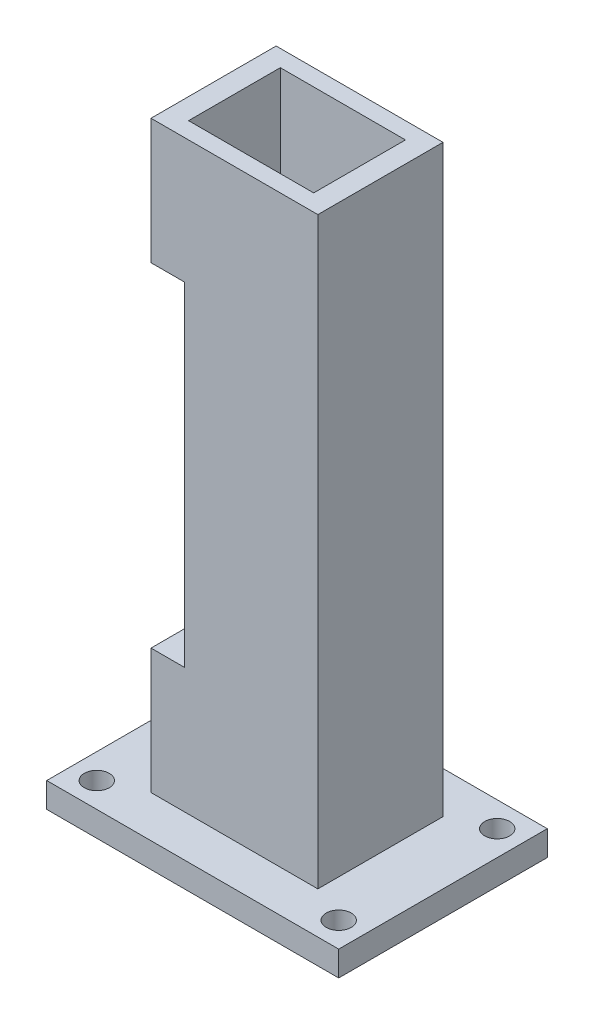
ISO-10303-21;
HEADER;
FILE_DESCRIPTION(('STEP AP214'),'2;1');
FILE_NAME('part.step','',(''),(''),'','','');
FILE_SCHEMA(('AUTOMOTIVE_DESIGN { 1 0 10303 214 1 1 1 1 }'));
ENDSEC;
DATA;
#1=APPLICATION_CONTEXT('core data for automotive mechanical design processes');
#2=APPLICATION_PROTOCOL_DEFINITION('international standard','automotive_design',2000,#1);
#3=PRODUCT_CONTEXT('',#1,'mechanical');
#4=PRODUCT('Part','Part','',(#3));
#5=PRODUCT_RELATED_PRODUCT_CATEGORY('part','',(#4));
#6=PRODUCT_DEFINITION_FORMATION('','',#4);
#7=PRODUCT_DEFINITION_CONTEXT('part definition',#1,'design');
#8=PRODUCT_DEFINITION('design','',#6,#7);
#9=PRODUCT_DEFINITION_SHAPE('','',#8);
#10=(LENGTH_UNIT() NAMED_UNIT(*) SI_UNIT(.MILLI.,.METRE.));
#11=(NAMED_UNIT(*) PLANE_ANGLE_UNIT() SI_UNIT($,.RADIAN.));
#12=(NAMED_UNIT(*) SI_UNIT($,.STERADIAN.) SOLID_ANGLE_UNIT());
#13=UNCERTAINTY_MEASURE_WITH_UNIT(LENGTH_MEASURE(1.E-05),#10,'distance_accuracy_value','');
#14=(GEOMETRIC_REPRESENTATION_CONTEXT(3) GLOBAL_UNCERTAINTY_ASSIGNED_CONTEXT((#13)) GLOBAL_UNIT_ASSIGNED_CONTEXT((#10,
#11,#12)) REPRESENTATION_CONTEXT('',''));
#15=CARTESIAN_POINT('',(0.,0.,0.));
#16=DIRECTION('',(0.,0.,1.));
#17=DIRECTION('',(1.,0.,0.));
#18=AXIS2_PLACEMENT_3D('',#15,#16,#17);
#19=CARTESIAN_POINT('',(-10.,73.,7.5));
#20=DIRECTION('',(1.,0.,0.));
#21=DIRECTION('',(0.,0.,-1.));
#22=AXIS2_PLACEMENT_3D('',#19,#20,#21);
#23=PLANE('',#22);
#24=DIRECTION('',(0.,-1.,0.));
#25=VECTOR('',#24,1.);
#26=CARTESIAN_POINT('',(-10.,73.,-7.5));
#27=LINE('',#26,#25);
#28=CARTESIAN_POINT('',(-10.,73.,-7.5));
#29=VERTEX_POINT('',#28);
#30=CARTESIAN_POINT('',(-10.,58.,-7.5));
#31=VERTEX_POINT('',#30);
#32=EDGE_CURVE('E200',#29,#31,#27,.T.);
#33=ORIENTED_EDGE('',*,*,#32,.T.);
#34=DIRECTION('',(0.,0.,1.));
#35=VECTOR('',#34,1.);
#36=CARTESIAN_POINT('',(-10.,58.,-12.501));
#37=LINE('',#36,#35);
#38=CARTESIAN_POINT('',(-10.,58.,7.5));
#39=VERTEX_POINT('',#38);
#40=EDGE_CURVE('E578',#31,#39,#37,.T.);
#41=ORIENTED_EDGE('',*,*,#40,.T.);
#42=DIRECTION('',(0.,-1.,0.));
#43=VECTOR('',#42,1.);
#44=CARTESIAN_POINT('',(-10.,73.,7.5));
#45=LINE('',#44,#43);
#46=CARTESIAN_POINT('',(-10.,73.,7.5));
#47=VERTEX_POINT('',#46);
#48=EDGE_CURVE('E201',#47,#39,#45,.T.);
#49=ORIENTED_EDGE('',*,*,#48,.F.);
#50=DIRECTION('',(0.,0.,1.));
#51=VECTOR('',#50,1.);
#52=CARTESIAN_POINT('',(-10.,73.,7.5));
#53=LINE('',#52,#51);
#54=EDGE_CURVE('E631',#29,#47,#53,.T.);
#55=ORIENTED_EDGE('',*,*,#54,.F.);
#56=EDGE_LOOP('',(#33,#41,#49,#55));
#57=FACE_BOUND('',#56,.T.);
#58=ADVANCED_FACE('F40',(#57),#23,.F.);
#59=CARTESIAN_POINT('',(-7.5,-0.001000000000001,5.5));
#60=DIRECTION('',(-1.,0.,0.));
#61=DIRECTION('',(0.,0.,1.));
#62=AXIS2_PLACEMENT_3D('',#59,#60,#61);
#63=PLANE('',#62);
#64=DIRECTION('',(0.,1.,0.));
#65=VECTOR('',#64,1.);
#66=CARTESIAN_POINT('',(-7.5,-0.001000000000001,5.5));
#67=LINE('',#66,#65);
#68=CARTESIAN_POINT('',(-7.5,58.,5.5));
#69=VERTEX_POINT('',#68);
#70=CARTESIAN_POINT('',(-7.5,73.,5.5));
#71=VERTEX_POINT('',#70);
#72=EDGE_CURVE('E615',#69,#71,#67,.T.);
#73=ORIENTED_EDGE('',*,*,#72,.F.);
#74=DIRECTION('',(0.,0.,1.));
#75=VECTOR('',#74,1.);
#76=CARTESIAN_POINT('',(-7.5,58.,-12.501));
#77=LINE('',#76,#75);
#78=CARTESIAN_POINT('',(-7.5,58.,-5.5));
#79=VERTEX_POINT('',#78);
#80=EDGE_CURVE('E559',#79,#69,#77,.T.);
#81=ORIENTED_EDGE('',*,*,#80,.F.);
#82=DIRECTION('',(0.,1.,0.));
#83=VECTOR('',#82,1.);
#84=CARTESIAN_POINT('',(-7.5,-0.001000000000001,-5.5));
#85=LINE('',#84,#83);
#86=CARTESIAN_POINT('',(-7.5,73.,-5.5));
#87=VERTEX_POINT('',#86);
#88=EDGE_CURVE('E619',#79,#87,#85,.T.);
#89=ORIENTED_EDGE('',*,*,#88,.T.);
#90=DIRECTION('',(0.,0.,1.));
#91=VECTOR('',#90,1.);
#92=CARTESIAN_POINT('',(-7.5,73.,5.5));
#93=LINE('',#92,#91);
#94=EDGE_CURVE('E602',#87,#71,#93,.T.);
#95=ORIENTED_EDGE('',*,*,#94,.T.);
#96=EDGE_LOOP('',(#73,#81,#89,#95));
#97=FACE_BOUND('',#96,.T.);
#98=ADVANCED_FACE('F263',(#97),#63,.F.);
#99=CARTESIAN_POINT('',(0.,3.,0.));
#100=DIRECTION('',(0.,-1.,0.));
#101=DIRECTION('',(0.,0.,-1.));
#102=AXIS2_PLACEMENT_3D('',#99,#100,#101);
#103=PLANE('',#102);
#104=CARTESIAN_POINT('',(14.5,3.,-9.50000000000001));
#105=DIRECTION('',(0.,1.,0.));
#106=DIRECTION('',(0.,0.,1.));
#107=AXIS2_PLACEMENT_3D('',#104,#105,#106);
#108=CIRCLE('',#107,1.5);
#109=CARTESIAN_POINT('',(14.5,3.,-8.00000000000001));
#110=VERTEX_POINT('',#109);
#111=EDGE_CURVE('E536',#110,#110,#108,.T.);
#112=ORIENTED_EDGE('',*,*,#111,.F.);
#113=EDGE_LOOP('',(#112));
#114=FACE_BOUND('',#113,.T.);
#115=CARTESIAN_POINT('',(-14.5,3.,9.5));
#116=DIRECTION('',(0.,1.,0.));
#117=DIRECTION('',(0.,0.,1.));
#118=AXIS2_PLACEMENT_3D('',#115,#116,#117);
#119=CIRCLE('',#118,1.5);
#120=CARTESIAN_POINT('',(-14.5,3.,11.));
#121=VERTEX_POINT('',#120);
#122=EDGE_CURVE('E542',#121,#121,#119,.T.);
#123=ORIENTED_EDGE('',*,*,#122,.F.);
#124=EDGE_LOOP('',(#123));
#125=FACE_BOUND('',#124,.T.);
#126=CARTESIAN_POINT('',(14.5,3.,9.5));
#127=DIRECTION('',(0.,1.,0.));
#128=DIRECTION('',(0.,0.,1.));
#129=AXIS2_PLACEMENT_3D('',#126,#127,#128);
#130=CIRCLE('',#129,1.5);
#131=CARTESIAN_POINT('',(14.5,3.,11.));
#132=VERTEX_POINT('',#131);
#133=EDGE_CURVE('E680',#132,#132,#130,.T.);
#134=ORIENTED_EDGE('',*,*,#133,.F.);
#135=EDGE_LOOP('',(#134));
#136=FACE_BOUND('',#135,.T.);
#137=CARTESIAN_POINT('',(-14.5,3.,-9.5));
#138=DIRECTION('',(0.,1.,0.));
#139=DIRECTION('',(0.,0.,1.));
#140=AXIS2_PLACEMENT_3D('',#137,#138,#139);
#141=CIRCLE('',#140,1.5);
#142=CARTESIAN_POINT('',(-14.5,3.,-8.00000000000001));
#143=VERTEX_POINT('',#142);
#144=EDGE_CURVE('E549',#143,#143,#141,.T.);
#145=ORIENTED_EDGE('',*,*,#144,.F.);
#146=EDGE_LOOP('',(#145));
#147=FACE_BOUND('',#146,.T.);
#148=DIRECTION('',(0.,0.,-1.));
#149=VECTOR('',#148,1.);
#150=CARTESIAN_POINT('',(17.5,3.,12.5));
#151=LINE('',#150,#149);
#152=CARTESIAN_POINT('',(17.5,3.,12.5));
#153=VERTEX_POINT('',#152);
#154=CARTESIAN_POINT('',(17.5,3.,-12.5));
#155=VERTEX_POINT('',#154);
#156=EDGE_CURVE('E211',#153,#155,#151,.T.);
#157=ORIENTED_EDGE('',*,*,#156,.T.);
#158=DIRECTION('',(-1.,0.,0.));
#159=VECTOR('',#158,1.);
#160=CARTESIAN_POINT('',(-17.5,3.,-12.5));
#161=LINE('',#160,#159);
#162=CARTESIAN_POINT('',(-17.5,3.,-12.5));
#163=VERTEX_POINT('',#162);
#164=EDGE_CURVE('E214',#155,#163,#161,.T.);
#165=ORIENTED_EDGE('',*,*,#164,.T.);
#166=DIRECTION('',(0.,0.,1.));
#167=VECTOR('',#166,1.);
#168=CARTESIAN_POINT('',(-17.5,3.,12.5));
#169=LINE('',#168,#167);
#170=CARTESIAN_POINT('',(-17.5,3.,12.5));
#171=VERTEX_POINT('',#170);
#172=EDGE_CURVE('E217',#163,#171,#169,.T.);
#173=ORIENTED_EDGE('',*,*,#172,.T.);
#174=DIRECTION('',(1.,0.,0.));
#175=VECTOR('',#174,1.);
#176=CARTESIAN_POINT('',(-17.5,3.,12.5));
#177=LINE('',#176,#175);
#178=EDGE_CURVE('E219',#171,#153,#177,.T.);
#179=ORIENTED_EDGE('',*,*,#178,.T.);
#180=EDGE_LOOP('',(#157,#165,#173,#179));
#181=FACE_BOUND('',#180,.T.);
#182=DIRECTION('',(0.,0.,-1.));
#183=VECTOR('',#182,1.);
#184=CARTESIAN_POINT('',(10.,3.,7.5));
#185=LINE('',#184,#183);
#186=CARTESIAN_POINT('',(10.,3.,7.5));
#187=VERTEX_POINT('',#186);
#188=CARTESIAN_POINT('',(10.,3.,-7.5));
#189=VERTEX_POINT('',#188);
#190=EDGE_CURVE('E624',#187,#189,#185,.T.);
#191=ORIENTED_EDGE('',*,*,#190,.F.);
#192=DIRECTION('',(1.,0.,0.));
#193=VECTOR('',#192,1.);
#194=CARTESIAN_POINT('',(-10.,3.,7.5));
#195=LINE('',#194,#193);
#196=CARTESIAN_POINT('',(-10.,3.,7.5));
#197=VERTEX_POINT('',#196);
#198=EDGE_CURVE('E629',#197,#187,#195,.T.);
#199=ORIENTED_EDGE('',*,*,#198,.F.);
#200=DIRECTION('',(0.,0.,1.));
#201=VECTOR('',#200,1.);
#202=CARTESIAN_POINT('',(-10.,3.,7.5));
#203=LINE('',#202,#201);
#204=CARTESIAN_POINT('',(-10.,3.,-7.5));
#205=VERTEX_POINT('',#204);
#206=EDGE_CURVE('E639',#205,#197,#203,.T.);
#207=ORIENTED_EDGE('',*,*,#206,.F.);
#208=DIRECTION('',(-1.,0.,0.));
#209=VECTOR('',#208,1.);
#210=CARTESIAN_POINT('',(-10.,3.,-7.5));
#211=LINE('',#210,#209);
#212=EDGE_CURVE('E199',#189,#205,#211,.T.);
#213=ORIENTED_EDGE('',*,*,#212,.F.);
#214=EDGE_LOOP('',(#191,#199,#207,#213));
#215=FACE_BOUND('',#214,.T.);
#216=ADVANCED_FACE('F253',(#114,#125,#136,#147,#181,#215),#103,.F.);
#217=CARTESIAN_POINT('',(17.5,3.,12.5));
#218=DIRECTION('',(-1.,0.,0.));
#219=DIRECTION('',(0.,0.,1.));
#220=AXIS2_PLACEMENT_3D('',#217,#218,#219);
#221=PLANE('',#220);
#222=DIRECTION('',(0.,0.,-1.));
#223=VECTOR('',#222,1.);
#224=CARTESIAN_POINT('',(17.5,0.,12.5));
#225=LINE('',#224,#223);
#226=CARTESIAN_POINT('',(17.5,0.,12.5));
#227=VERTEX_POINT('',#226);
#228=CARTESIAN_POINT('',(17.5,0.,-12.5));
#229=VERTEX_POINT('',#228);
#230=EDGE_CURVE('E210',#227,#229,#225,.T.);
#231=ORIENTED_EDGE('',*,*,#230,.T.);
#232=DIRECTION('',(0.,-1.,0.));
#233=VECTOR('',#232,1.);
#234=CARTESIAN_POINT('',(17.5,3.,-12.5));
#235=LINE('',#234,#233);
#236=EDGE_CURVE('E11',#155,#229,#235,.T.);
#237=ORIENTED_EDGE('',*,*,#236,.F.);
#238=ORIENTED_EDGE('',*,*,#156,.F.);
#239=DIRECTION('',(0.,-1.,0.));
#240=VECTOR('',#239,1.);
#241=CARTESIAN_POINT('',(17.5,3.,12.5));
#242=LINE('',#241,#240);
#243=EDGE_CURVE('E221',#153,#227,#242,.T.);
#244=ORIENTED_EDGE('',*,*,#243,.T.);
#245=EDGE_LOOP('',(#231,#237,#238,#244));
#246=FACE_BOUND('',#245,.T.);
#247=ADVANCED_FACE('F42',(#246),#221,.F.);
#248=CARTESIAN_POINT('',(-17.5,3.,-12.5));
#249=DIRECTION('',(0.,0.,1.));
#250=DIRECTION('',(1.,0.,0.));
#251=AXIS2_PLACEMENT_3D('',#248,#249,#250);
#252=PLANE('',#251);
#253=DIRECTION('',(-1.,0.,0.));
#254=VECTOR('',#253,1.);
#255=CARTESIAN_POINT('',(-17.5,0.,-12.5));
#256=LINE('',#255,#254);
#257=CARTESIAN_POINT('',(-17.5,0.,-12.5));
#258=VERTEX_POINT('',#257);
#259=EDGE_CURVE('E224',#229,#258,#256,.T.);
#260=ORIENTED_EDGE('',*,*,#259,.T.);
#261=DIRECTION('',(0.,-1.,0.));
#262=VECTOR('',#261,1.);
#263=CARTESIAN_POINT('',(-17.5,3.,-12.5));
#264=LINE('',#263,#262);
#265=EDGE_CURVE('E48',#163,#258,#264,.T.);
#266=ORIENTED_EDGE('',*,*,#265,.F.);
#267=ORIENTED_EDGE('',*,*,#164,.F.);
#268=ORIENTED_EDGE('',*,*,#236,.T.);
#269=EDGE_LOOP('',(#260,#266,#267,#268));
#270=FACE_BOUND('',#269,.T.);
#271=ADVANCED_FACE('F255',(#270),#252,.F.);
#272=CARTESIAN_POINT('',(-17.5,3.,12.5));
#273=DIRECTION('',(1.,0.,0.));
#274=DIRECTION('',(0.,0.,-1.));
#275=AXIS2_PLACEMENT_3D('',#272,#273,#274);
#276=PLANE('',#275);
#277=DIRECTION('',(0.,0.,1.));
#278=VECTOR('',#277,1.);
#279=CARTESIAN_POINT('',(-17.5,0.,12.5));
#280=LINE('',#279,#278);
#281=CARTESIAN_POINT('',(-17.5,0.,12.5));
#282=VERTEX_POINT('',#281);
#283=EDGE_CURVE('E226',#258,#282,#280,.T.);
#284=ORIENTED_EDGE('',*,*,#283,.T.);
#285=DIRECTION('',(0.,-1.,0.));
#286=VECTOR('',#285,1.);
#287=CARTESIAN_POINT('',(-17.5,3.,12.5));
#288=LINE('',#287,#286);
#289=EDGE_CURVE('E231',#171,#282,#288,.T.);
#290=ORIENTED_EDGE('',*,*,#289,.F.);
#291=ORIENTED_EDGE('',*,*,#172,.F.);
#292=ORIENTED_EDGE('',*,*,#265,.T.);
#293=EDGE_LOOP('',(#284,#290,#291,#292));
#294=FACE_BOUND('',#293,.T.);
#295=ADVANCED_FACE('F238',(#294),#276,.F.);
#296=CARTESIAN_POINT('',(-17.5,3.,12.5));
#297=DIRECTION('',(0.,0.,-1.));
#298=DIRECTION('',(-1.,0.,0.));
#299=AXIS2_PLACEMENT_3D('',#296,#297,#298);
#300=PLANE('',#299);
#301=DIRECTION('',(1.,0.,0.));
#302=VECTOR('',#301,1.);
#303=CARTESIAN_POINT('',(-17.5,0.,12.5));
#304=LINE('',#303,#302);
#305=EDGE_CURVE('E215',#282,#227,#304,.T.);
#306=ORIENTED_EDGE('',*,*,#305,.T.);
#307=ORIENTED_EDGE('',*,*,#243,.F.);
#308=ORIENTED_EDGE('',*,*,#178,.F.);
#309=ORIENTED_EDGE('',*,*,#289,.T.);
#310=EDGE_LOOP('',(#306,#307,#308,#309));
#311=FACE_BOUND('',#310,.T.);
#312=ADVANCED_FACE('F247',(#311),#300,.F.);
#313=CARTESIAN_POINT('',(0.,0.,0.));
#314=DIRECTION('',(0.,-1.,0.));
#315=DIRECTION('',(0.,0.,-1.));
#316=AXIS2_PLACEMENT_3D('',#313,#314,#315);
#317=PLANE('',#316);
#318=CARTESIAN_POINT('',(14.5,0.,-9.50000000000001));
#319=DIRECTION('',(0.,-1.,0.));
#320=DIRECTION('',(0.,0.,-1.));
#321=AXIS2_PLACEMENT_3D('',#318,#319,#320);
#322=CIRCLE('',#321,1.5);
#323=CARTESIAN_POINT('',(14.5,0.,-8.00000000000001));
#324=VERTEX_POINT('',#323);
#325=EDGE_CURVE('E533',#324,#324,#322,.F.);
#326=ORIENTED_EDGE('',*,*,#325,.T.);
#327=EDGE_LOOP('',(#326));
#328=FACE_BOUND('',#327,.T.);
#329=CARTESIAN_POINT('',(-14.5,0.,9.5));
#330=DIRECTION('',(0.,-1.,0.));
#331=DIRECTION('',(0.,0.,-1.));
#332=AXIS2_PLACEMENT_3D('',#329,#330,#331);
#333=CIRCLE('',#332,1.5);
#334=CARTESIAN_POINT('',(-14.5,0.,11.));
#335=VERTEX_POINT('',#334);
#336=EDGE_CURVE('E537',#335,#335,#333,.F.);
#337=ORIENTED_EDGE('',*,*,#336,.T.);
#338=EDGE_LOOP('',(#337));
#339=FACE_BOUND('',#338,.T.);
#340=CARTESIAN_POINT('',(14.5,0.,9.5));
#341=DIRECTION('',(0.,-1.,0.));
#342=DIRECTION('',(0.,0.,-1.));
#343=AXIS2_PLACEMENT_3D('',#340,#341,#342);
#344=CIRCLE('',#343,1.5);
#345=CARTESIAN_POINT('',(14.5,0.,11.));
#346=VERTEX_POINT('',#345);
#347=EDGE_CURVE('E548',#346,#346,#344,.F.);
#348=ORIENTED_EDGE('',*,*,#347,.T.);
#349=EDGE_LOOP('',(#348));
#350=FACE_BOUND('',#349,.T.);
#351=CARTESIAN_POINT('',(-14.5,0.,-9.5));
#352=DIRECTION('',(0.,-1.,0.));
#353=DIRECTION('',(0.,0.,-1.));
#354=AXIS2_PLACEMENT_3D('',#351,#352,#353);
#355=CIRCLE('',#354,1.5);
#356=CARTESIAN_POINT('',(-14.5,0.,-8.00000000000001));
#357=VERTEX_POINT('',#356);
#358=EDGE_CURVE('E539',#357,#357,#355,.F.);
#359=ORIENTED_EDGE('',*,*,#358,.T.);
#360=EDGE_LOOP('',(#359));
#361=FACE_BOUND('',#360,.T.);
#362=DIRECTION('',(0.,0.,-1.));
#363=VECTOR('',#362,1.);
#364=CARTESIAN_POINT('',(7.5,0.,5.5));
#365=LINE('',#364,#363);
#366=CARTESIAN_POINT('',(7.5,0.,5.5));
#367=VERTEX_POINT('',#366);
#368=CARTESIAN_POINT('',(7.5,0.,-5.5));
#369=VERTEX_POINT('',#368);
#370=EDGE_CURVE('E594',#367,#369,#365,.T.);
#371=ORIENTED_EDGE('',*,*,#370,.T.);
#372=DIRECTION('',(-1.,0.,0.));
#373=VECTOR('',#372,1.);
#374=CARTESIAN_POINT('',(-7.5,0.,-5.5));
#375=LINE('',#374,#373);
#376=CARTESIAN_POINT('',(-7.5,0.,-5.5));
#377=VERTEX_POINT('',#376);
#378=EDGE_CURVE('E611',#369,#377,#375,.T.);
#379=ORIENTED_EDGE('',*,*,#378,.T.);
#380=DIRECTION('',(0.,0.,1.));
#381=VECTOR('',#380,1.);
#382=CARTESIAN_POINT('',(-7.5,0.,5.5));
#383=LINE('',#382,#381);
#384=CARTESIAN_POINT('',(-7.5,0.,5.5));
#385=VERTEX_POINT('',#384);
#386=EDGE_CURVE('E183',#377,#385,#383,.T.);
#387=ORIENTED_EDGE('',*,*,#386,.T.);
#388=DIRECTION('',(1.,0.,0.));
#389=VECTOR('',#388,1.);
#390=CARTESIAN_POINT('',(-7.5,0.,5.5));
#391=LINE('',#390,#389);
#392=EDGE_CURVE('E591',#385,#367,#391,.T.);
#393=ORIENTED_EDGE('',*,*,#392,.T.);
#394=EDGE_LOOP('',(#371,#379,#387,#393));
#395=FACE_BOUND('',#394,.T.);
#396=ORIENTED_EDGE('',*,*,#230,.F.);
#397=ORIENTED_EDGE('',*,*,#305,.F.);
#398=ORIENTED_EDGE('',*,*,#283,.F.);
#399=ORIENTED_EDGE('',*,*,#259,.F.);
#400=EDGE_LOOP('',(#396,#397,#398,#399));
#401=FACE_BOUND('',#400,.T.);
#402=ADVANCED_FACE('F244',(#328,#339,#350,#361,#395,#401),#317,.T.);
#403=CARTESIAN_POINT('',(10.,73.,7.5));
#404=DIRECTION('',(-1.,0.,0.));
#405=DIRECTION('',(0.,0.,1.));
#406=AXIS2_PLACEMENT_3D('',#403,#404,#405);
#407=PLANE('',#406);
#408=ORIENTED_EDGE('',*,*,#190,.T.);
#409=DIRECTION('',(0.,-1.,0.));
#410=VECTOR('',#409,1.);
#411=CARTESIAN_POINT('',(10.,73.,-7.5));
#412=LINE('',#411,#410);
#413=CARTESIAN_POINT('',(10.,73.,-7.5));
#414=VERTEX_POINT('',#413);
#415=EDGE_CURVE('E204',#414,#189,#412,.T.);
#416=ORIENTED_EDGE('',*,*,#415,.F.);
#417=DIRECTION('',(0.,0.,-1.));
#418=VECTOR('',#417,1.);
#419=CARTESIAN_POINT('',(10.,73.,7.5));
#420=LINE('',#419,#418);
#421=CARTESIAN_POINT('',(10.,73.,7.5));
#422=VERTEX_POINT('',#421);
#423=EDGE_CURVE('E625',#422,#414,#420,.T.);
#424=ORIENTED_EDGE('',*,*,#423,.F.);
#425=DIRECTION('',(0.,-1.,0.));
#426=VECTOR('',#425,1.);
#427=CARTESIAN_POINT('',(10.,73.,7.5));
#428=LINE('',#427,#426);
#429=EDGE_CURVE('E635',#422,#187,#428,.T.);
#430=ORIENTED_EDGE('',*,*,#429,.T.);
#431=EDGE_LOOP('',(#408,#416,#424,#430));
#432=FACE_BOUND('',#431,.T.);
#433=ADVANCED_FACE('F282',(#432),#407,.F.);
#434=CARTESIAN_POINT('',(-10.,73.,-7.5));
#435=DIRECTION('',(0.,0.,1.));
#436=DIRECTION('',(1.,0.,0.));
#437=AXIS2_PLACEMENT_3D('',#434,#435,#436);
#438=PLANE('',#437);
#439=DIRECTION('',(0.,-1.,0.));
#440=VECTOR('',#439,1.);
#441=CARTESIAN_POINT('',(-6.,58.,-7.5));
#442=LINE('',#441,#440);
#443=CARTESIAN_POINT('',(-6.,58.,-7.5));
#444=VERTEX_POINT('',#443);
#445=CARTESIAN_POINT('',(-5.99999999999999,18.,-7.5));
#446=VERTEX_POINT('',#445);
#447=EDGE_CURVE('E567',#444,#446,#442,.T.);
#448=ORIENTED_EDGE('',*,*,#447,.F.);
#449=DIRECTION('',(1.,0.,0.));
#450=VECTOR('',#449,1.);
#451=CARTESIAN_POINT('',(-10.,58.,-7.5));
#452=LINE('',#451,#450);
#453=EDGE_CURVE('E569',#31,#444,#452,.T.);
#454=ORIENTED_EDGE('',*,*,#453,.F.);
#455=ORIENTED_EDGE('',*,*,#32,.F.);
#456=DIRECTION('',(-1.,0.,0.));
#457=VECTOR('',#456,1.);
#458=CARTESIAN_POINT('',(-10.,73.,-7.5));
#459=LINE('',#458,#457);
#460=EDGE_CURVE('E628',#414,#29,#459,.T.);
#461=ORIENTED_EDGE('',*,*,#460,.F.);
#462=ORIENTED_EDGE('',*,*,#415,.T.);
#463=ORIENTED_EDGE('',*,*,#212,.T.);
#464=CARTESIAN_POINT('',(-10.,18.,-7.5));
#465=VERTEX_POINT('',#464);
#466=EDGE_CURVE('E190',#465,#205,#27,.T.);
#467=ORIENTED_EDGE('',*,*,#466,.F.);
#468=DIRECTION('',(-1.,0.,0.));
#469=VECTOR('',#468,1.);
#470=CARTESIAN_POINT('',(-5.99999999999999,18.,-7.5));
#471=LINE('',#470,#469);
#472=EDGE_CURVE('E176',#446,#465,#471,.T.);
#473=ORIENTED_EDGE('',*,*,#472,.F.);
#474=EDGE_LOOP('',(#448,#454,#455,#461,#462,#463,#467,#473));
#475=FACE_BOUND('',#474,.T.);
#476=ADVANCED_FACE('F197',(#475),#438,.F.);
#477=CARTESIAN_POINT('',(-10.,18.,7.5));
#478=VERTEX_POINT('',#477);
#479=EDGE_CURVE('E192',#478,#197,#45,.T.);
#480=ORIENTED_EDGE('',*,*,#479,.F.);
#481=DIRECTION('',(0.,0.,1.));
#482=VECTOR('',#481,1.);
#483=CARTESIAN_POINT('',(-10.,18.,-12.501));
#484=LINE('',#483,#482);
#485=EDGE_CURVE('E55',#465,#478,#484,.T.);
#486=ORIENTED_EDGE('',*,*,#485,.F.);
#487=ORIENTED_EDGE('',*,*,#466,.T.);
#488=ORIENTED_EDGE('',*,*,#206,.T.);
#489=EDGE_LOOP('',(#480,#486,#487,#488));
#490=FACE_BOUND('',#489,.T.);
#491=ADVANCED_FACE('F188',(#490),#23,.F.);
#492=CARTESIAN_POINT('',(-10.,73.,7.5));
#493=DIRECTION('',(0.,0.,-1.));
#494=DIRECTION('',(-1.,0.,0.));
#495=AXIS2_PLACEMENT_3D('',#492,#493,#494);
#496=PLANE('',#495);
#497=ORIENTED_EDGE('',*,*,#48,.T.);
#498=DIRECTION('',(-1.,0.,0.));
#499=VECTOR('',#498,1.);
#500=CARTESIAN_POINT('',(-10.,58.,7.5));
#501=LINE('',#500,#499);
#502=CARTESIAN_POINT('',(-6.,58.,7.5));
#503=VERTEX_POINT('',#502);
#504=EDGE_CURVE('E194',#503,#39,#501,.T.);
#505=ORIENTED_EDGE('',*,*,#504,.F.);
#506=DIRECTION('',(0.,1.,0.));
#507=VECTOR('',#506,1.);
#508=CARTESIAN_POINT('',(-6.,58.,7.5));
#509=LINE('',#508,#507);
#510=CARTESIAN_POINT('',(-5.99999999999999,18.,7.5));
#511=VERTEX_POINT('',#510);
#512=EDGE_CURVE('E574',#511,#503,#509,.T.);
#513=ORIENTED_EDGE('',*,*,#512,.F.);
#514=DIRECTION('',(1.,0.,0.));
#515=VECTOR('',#514,1.);
#516=CARTESIAN_POINT('',(-5.99999999999999,18.,7.5));
#517=LINE('',#516,#515);
#518=EDGE_CURVE('E572',#478,#511,#517,.T.);
#519=ORIENTED_EDGE('',*,*,#518,.F.);
#520=ORIENTED_EDGE('',*,*,#479,.T.);
#521=ORIENTED_EDGE('',*,*,#198,.T.);
#522=ORIENTED_EDGE('',*,*,#429,.F.);
#523=DIRECTION('',(1.,0.,0.));
#524=VECTOR('',#523,1.);
#525=CARTESIAN_POINT('',(-10.,73.,7.5));
#526=LINE('',#525,#524);
#527=EDGE_CURVE('E633',#47,#422,#526,.T.);
#528=ORIENTED_EDGE('',*,*,#527,.F.);
#529=EDGE_LOOP('',(#497,#505,#513,#519,#520,#521,#522,#528));
#530=FACE_BOUND('',#529,.T.);
#531=ADVANCED_FACE('F275',(#530),#496,.F.);
#532=CARTESIAN_POINT('',(0.,73.,0.));
#533=DIRECTION('',(0.,-1.,0.));
#534=DIRECTION('',(0.,0.,-1.));
#535=AXIS2_PLACEMENT_3D('',#532,#533,#534);
#536=PLANE('',#535);
#537=DIRECTION('',(-1.,0.,0.));
#538=VECTOR('',#537,1.);
#539=CARTESIAN_POINT('',(-7.5,73.,-5.5));
#540=LINE('',#539,#538);
#541=CARTESIAN_POINT('',(7.5,73.,-5.5));
#542=VERTEX_POINT('',#541);
#543=EDGE_CURVE('E599',#542,#87,#540,.T.);
#544=ORIENTED_EDGE('',*,*,#543,.F.);
#545=DIRECTION('',(0.,0.,-1.));
#546=VECTOR('',#545,1.);
#547=CARTESIAN_POINT('',(7.5,73.,5.5));
#548=LINE('',#547,#546);
#549=CARTESIAN_POINT('',(7.5,73.,5.5));
#550=VERTEX_POINT('',#549);
#551=EDGE_CURVE('E597',#550,#542,#548,.T.);
#552=ORIENTED_EDGE('',*,*,#551,.F.);
#553=DIRECTION('',(1.,0.,0.));
#554=VECTOR('',#553,1.);
#555=CARTESIAN_POINT('',(-7.5,73.,5.5));
#556=LINE('',#555,#554);
#557=EDGE_CURVE('E605',#71,#550,#556,.T.);
#558=ORIENTED_EDGE('',*,*,#557,.F.);
#559=ORIENTED_EDGE('',*,*,#94,.F.);
#560=EDGE_LOOP('',(#544,#552,#558,#559));
#561=FACE_BOUND('',#560,.T.);
#562=ORIENTED_EDGE('',*,*,#423,.T.);
#563=ORIENTED_EDGE('',*,*,#460,.T.);
#564=ORIENTED_EDGE('',*,*,#54,.T.);
#565=ORIENTED_EDGE('',*,*,#527,.T.);
#566=EDGE_LOOP('',(#562,#563,#564,#565));
#567=FACE_BOUND('',#566,.T.);
#568=ADVANCED_FACE('F280',(#561,#567),#536,.F.);
#569=CARTESIAN_POINT('',(7.5,-0.001000000000001,5.5));
#570=DIRECTION('',(1.,0.,0.));
#571=DIRECTION('',(0.,0.,-1.));
#572=AXIS2_PLACEMENT_3D('',#569,#570,#571);
#573=PLANE('',#572);
#574=DIRECTION('',(0.,1.,0.));
#575=VECTOR('',#574,1.);
#576=CARTESIAN_POINT('',(7.5,-0.001000000000001,5.5));
#577=LINE('',#576,#575);
#578=EDGE_CURVE('E609',#367,#550,#577,.T.);
#579=ORIENTED_EDGE('',*,*,#578,.T.);
#580=ORIENTED_EDGE('',*,*,#551,.T.);
#581=DIRECTION('',(0.,1.,0.));
#582=VECTOR('',#581,1.);
#583=CARTESIAN_POINT('',(7.5,-0.001000000000001,-5.5));
#584=LINE('',#583,#582);
#585=EDGE_CURVE('E608',#369,#542,#584,.T.);
#586=ORIENTED_EDGE('',*,*,#585,.F.);
#587=ORIENTED_EDGE('',*,*,#370,.F.);
#588=EDGE_LOOP('',(#579,#580,#586,#587));
#589=FACE_BOUND('',#588,.T.);
#590=ADVANCED_FACE('F322',(#589),#573,.F.);
#591=CARTESIAN_POINT('',(-7.5,-0.001000000000001,5.5));
#592=DIRECTION('',(0.,0.,1.));
#593=DIRECTION('',(1.,0.,0.));
#594=AXIS2_PLACEMENT_3D('',#591,#592,#593);
#595=PLANE('',#594);
#596=DIRECTION('',(0.,-1.,0.));
#597=VECTOR('',#596,1.);
#598=CARTESIAN_POINT('',(-6.,58.,5.5));
#599=LINE('',#598,#597);
#600=CARTESIAN_POINT('',(-6.,58.,5.5));
#601=VERTEX_POINT('',#600);
#602=CARTESIAN_POINT('',(-5.99999999999999,18.,5.5));
#603=VERTEX_POINT('',#602);
#604=EDGE_CURVE('E561',#601,#603,#599,.T.);
#605=ORIENTED_EDGE('',*,*,#604,.F.);
#606=DIRECTION('',(1.,0.,0.));
#607=VECTOR('',#606,1.);
#608=CARTESIAN_POINT('',(-10.,58.,5.5));
#609=LINE('',#608,#607);
#610=EDGE_CURVE('E564',#69,#601,#609,.T.);
#611=ORIENTED_EDGE('',*,*,#610,.F.);
#612=ORIENTED_EDGE('',*,*,#72,.T.);
#613=ORIENTED_EDGE('',*,*,#557,.T.);
#614=ORIENTED_EDGE('',*,*,#578,.F.);
#615=ORIENTED_EDGE('',*,*,#392,.F.);
#616=CARTESIAN_POINT('',(-7.5,18.,5.5));
#617=VERTEX_POINT('',#616);
#618=EDGE_CURVE('E612',#385,#617,#67,.T.);
#619=ORIENTED_EDGE('',*,*,#618,.T.);
#620=DIRECTION('',(-1.,0.,0.));
#621=VECTOR('',#620,1.);
#622=CARTESIAN_POINT('',(-5.99999999999999,18.,5.5));
#623=LINE('',#622,#621);
#624=EDGE_CURVE('E184',#603,#617,#623,.T.);
#625=ORIENTED_EDGE('',*,*,#624,.F.);
#626=EDGE_LOOP('',(#605,#611,#612,#613,#614,#615,#619,#625));
#627=FACE_BOUND('',#626,.T.);
#628=ADVANCED_FACE('F333',(#627),#595,.F.);
#629=CARTESIAN_POINT('',(-7.5,18.,-5.5));
#630=VERTEX_POINT('',#629);
#631=EDGE_CURVE('E616',#377,#630,#85,.T.);
#632=ORIENTED_EDGE('',*,*,#631,.T.);
#633=DIRECTION('',(0.,0.,-1.));
#634=VECTOR('',#633,1.);
#635=CARTESIAN_POINT('',(-7.5,18.,-12.501));
#636=LINE('',#635,#634);
#637=EDGE_CURVE('E62',#617,#630,#636,.T.);
#638=ORIENTED_EDGE('',*,*,#637,.F.);
#639=ORIENTED_EDGE('',*,*,#618,.F.);
#640=ORIENTED_EDGE('',*,*,#386,.F.);
#641=EDGE_LOOP('',(#632,#638,#639,#640));
#642=FACE_BOUND('',#641,.T.);
#643=ADVANCED_FACE('F271',(#642),#63,.F.);
#644=CARTESIAN_POINT('',(-7.5,-0.001000000000001,-5.5));
#645=DIRECTION('',(0.,0.,-1.));
#646=DIRECTION('',(-1.,0.,0.));
#647=AXIS2_PLACEMENT_3D('',#644,#645,#646);
#648=PLANE('',#647);
#649=ORIENTED_EDGE('',*,*,#88,.F.);
#650=DIRECTION('',(-1.,0.,0.));
#651=VECTOR('',#650,1.);
#652=CARTESIAN_POINT('',(-10.,58.,-5.5));
#653=LINE('',#652,#651);
#654=CARTESIAN_POINT('',(-6.,58.,-5.5));
#655=VERTEX_POINT('',#654);
#656=EDGE_CURVE('E557',#655,#79,#653,.T.);
#657=ORIENTED_EDGE('',*,*,#656,.F.);
#658=DIRECTION('',(0.,1.,0.));
#659=VECTOR('',#658,1.);
#660=CARTESIAN_POINT('',(-6.,58.,-5.5));
#661=LINE('',#660,#659);
#662=CARTESIAN_POINT('',(-5.99999999999999,18.,-5.5));
#663=VERTEX_POINT('',#662);
#664=EDGE_CURVE('E552',#663,#655,#661,.T.);
#665=ORIENTED_EDGE('',*,*,#664,.F.);
#666=DIRECTION('',(1.,0.,0.));
#667=VECTOR('',#666,1.);
#668=CARTESIAN_POINT('',(-5.99999999999999,18.,-5.5));
#669=LINE('',#668,#667);
#670=EDGE_CURVE('E581',#630,#663,#669,.T.);
#671=ORIENTED_EDGE('',*,*,#670,.F.);
#672=ORIENTED_EDGE('',*,*,#631,.F.);
#673=ORIENTED_EDGE('',*,*,#378,.F.);
#674=ORIENTED_EDGE('',*,*,#585,.T.);
#675=ORIENTED_EDGE('',*,*,#543,.T.);
#676=EDGE_LOOP('',(#649,#657,#665,#671,#672,#673,#674,#675));
#677=FACE_BOUND('',#676,.T.);
#678=ADVANCED_FACE('F382',(#677),#648,.F.);
#679=CARTESIAN_POINT('',(-10.,58.,-12.501));
#680=DIRECTION('',(0.,1.,0.));
#681=DIRECTION('',(-1.,0.,0.));
#682=AXIS2_PLACEMENT_3D('',#679,#680,#681);
#683=PLANE('',#682);
#684=ORIENTED_EDGE('',*,*,#453,.T.);
#685=DIRECTION('',(0.,0.,1.));
#686=VECTOR('',#685,1.);
#687=CARTESIAN_POINT('',(-6.,58.,-12.501));
#688=LINE('',#687,#686);
#689=EDGE_CURVE('E582',#444,#655,#688,.T.);
#690=ORIENTED_EDGE('',*,*,#689,.T.);
#691=ORIENTED_EDGE('',*,*,#656,.T.);
#692=ORIENTED_EDGE('',*,*,#80,.T.);
#693=ORIENTED_EDGE('',*,*,#610,.T.);
#694=EDGE_CURVE('E583',#601,#503,#688,.T.);
#695=ORIENTED_EDGE('',*,*,#694,.T.);
#696=ORIENTED_EDGE('',*,*,#504,.T.);
#697=ORIENTED_EDGE('',*,*,#40,.F.);
#698=EDGE_LOOP('',(#684,#690,#691,#692,#693,#695,#696,#697));
#699=FACE_BOUND('',#698,.T.);
#700=ADVANCED_FACE('F392',(#699),#683,.F.);
#701=CARTESIAN_POINT('',(-6.,58.,-12.501));
#702=DIRECTION('',(1.,0.,0.));
#703=DIRECTION('',(0.,1.,0.));
#704=AXIS2_PLACEMENT_3D('',#701,#702,#703);
#705=PLANE('',#704);
#706=ORIENTED_EDGE('',*,*,#447,.T.);
#707=DIRECTION('',(0.,0.,1.));
#708=VECTOR('',#707,1.);
#709=CARTESIAN_POINT('',(-5.99999999999999,18.,-12.501));
#710=LINE('',#709,#708);
#711=EDGE_CURVE('E178',#446,#663,#710,.T.);
#712=ORIENTED_EDGE('',*,*,#711,.T.);
#713=ORIENTED_EDGE('',*,*,#664,.T.);
#714=ORIENTED_EDGE('',*,*,#689,.F.);
#715=EDGE_LOOP('',(#706,#712,#713,#714));
#716=FACE_BOUND('',#715,.T.);
#717=ADVANCED_FACE('F402',(#716),#705,.F.);
#718=ORIENTED_EDGE('',*,*,#604,.T.);
#719=EDGE_CURVE('E193',#603,#511,#710,.T.);
#720=ORIENTED_EDGE('',*,*,#719,.T.);
#721=ORIENTED_EDGE('',*,*,#512,.T.);
#722=ORIENTED_EDGE('',*,*,#694,.F.);
#723=EDGE_LOOP('',(#718,#720,#721,#722));
#724=FACE_BOUND('',#723,.T.);
#725=ADVANCED_FACE('F412',(#724),#705,.F.);
#726=CARTESIAN_POINT('',(-5.99999999999999,18.,-12.501));
#727=DIRECTION('',(0.,-1.,0.));
#728=DIRECTION('',(1.,0.,0.));
#729=AXIS2_PLACEMENT_3D('',#726,#727,#728);
#730=PLANE('',#729);
#731=ORIENTED_EDGE('',*,*,#472,.T.);
#732=ORIENTED_EDGE('',*,*,#485,.T.);
#733=ORIENTED_EDGE('',*,*,#518,.T.);
#734=ORIENTED_EDGE('',*,*,#719,.F.);
#735=ORIENTED_EDGE('',*,*,#624,.T.);
#736=ORIENTED_EDGE('',*,*,#637,.T.);
#737=ORIENTED_EDGE('',*,*,#670,.T.);
#738=ORIENTED_EDGE('',*,*,#711,.F.);
#739=EDGE_LOOP('',(#731,#732,#733,#734,#735,#736,#737,#738));
#740=FACE_BOUND('',#739,.T.);
#741=ADVANCED_FACE('F177',(#740),#730,.F.);
#742=CARTESIAN_POINT('',(-14.5,-0.00100000000000013,-9.5));
#743=DIRECTION('',(0.,1.,0.));
#744=DIRECTION('',(0.,0.,1.));
#745=AXIS2_PLACEMENT_3D('',#742,#743,#744);
#746=CYLINDRICAL_SURFACE('',#745,1.5);
#747=CARTESIAN_POINT('',(-14.5,0.,-8.00000000000001));
#748=CARTESIAN_POINT('',(-14.5,0.03125,-8.00000000000001));
#749=CARTESIAN_POINT('',(-14.5,0.0625,-8.00000000000001));
#750=CARTESIAN_POINT('',(-14.5,0.125,-8.00000000000001));
#751=CARTESIAN_POINT('',(-14.5,0.15625,-8.00000000000001));
#752=CARTESIAN_POINT('',(-14.5,0.21875,-8.00000000000001));
#753=CARTESIAN_POINT('',(-14.5,0.25,-8.00000000000001));
#754=CARTESIAN_POINT('',(-14.5,0.3125,-8.00000000000001));
#755=CARTESIAN_POINT('',(-14.5,0.34375,-8.00000000000001));
#756=CARTESIAN_POINT('',(-14.5,0.40625,-8.00000000000001));
#757=CARTESIAN_POINT('',(-14.5,0.4375,-8.00000000000001));
#758=CARTESIAN_POINT('',(-14.5,0.5,-8.00000000000001));
#759=CARTESIAN_POINT('',(-14.5,0.53125,-8.00000000000001));
#760=CARTESIAN_POINT('',(-14.5,0.59375,-8.00000000000001));
#761=CARTESIAN_POINT('',(-14.5,0.625,-8.00000000000001));
#762=CARTESIAN_POINT('',(-14.5,0.6875,-8.00000000000001));
#763=CARTESIAN_POINT('',(-14.5,0.71875,-8.00000000000001));
#764=CARTESIAN_POINT('',(-14.5,0.78125,-8.00000000000001));
#765=CARTESIAN_POINT('',(-14.5,0.8125,-8.00000000000001));
#766=CARTESIAN_POINT('',(-14.5,0.875,-8.00000000000001));
#767=CARTESIAN_POINT('',(-14.5,0.90625,-8.00000000000001));
#768=CARTESIAN_POINT('',(-14.5,0.96875,-8.00000000000001));
#769=CARTESIAN_POINT('',(-14.5,1.,-8.00000000000001));
#770=CARTESIAN_POINT('',(-14.5,1.0625,-8.00000000000001));
#771=CARTESIAN_POINT('',(-14.5,1.09375,-8.00000000000001));
#772=CARTESIAN_POINT('',(-14.5,1.15625,-8.00000000000001));
#773=CARTESIAN_POINT('',(-14.5,1.1875,-8.00000000000001));
#774=CARTESIAN_POINT('',(-14.5,1.25,-8.00000000000001));
#775=CARTESIAN_POINT('',(-14.5,1.28125,-8.00000000000001));
#776=CARTESIAN_POINT('',(-14.5,1.34375,-8.00000000000001));
#777=CARTESIAN_POINT('',(-14.5,1.375,-8.00000000000001));
#778=CARTESIAN_POINT('',(-14.5,1.4375,-8.00000000000001));
#779=CARTESIAN_POINT('',(-14.5,1.46875,-8.00000000000001));
#780=CARTESIAN_POINT('',(-14.5,1.53125,-8.00000000000001));
#781=CARTESIAN_POINT('',(-14.5,1.5625,-8.00000000000001));
#782=CARTESIAN_POINT('',(-14.5,1.625,-8.00000000000001));
#783=CARTESIAN_POINT('',(-14.5,1.65625,-8.00000000000001));
#784=CARTESIAN_POINT('',(-14.5,1.71875,-8.00000000000001));
#785=CARTESIAN_POINT('',(-14.5,1.75,-8.00000000000001));
#786=CARTESIAN_POINT('',(-14.5,1.8125,-8.00000000000001));
#787=CARTESIAN_POINT('',(-14.5,1.84375,-8.00000000000001));
#788=CARTESIAN_POINT('',(-14.5,1.90625,-8.00000000000001));
#789=CARTESIAN_POINT('',(-14.5,1.9375,-8.00000000000001));
#790=CARTESIAN_POINT('',(-14.5,2.,-8.00000000000001));
#791=CARTESIAN_POINT('',(-14.5,2.03125,-8.00000000000001));
#792=CARTESIAN_POINT('',(-14.5,2.09375,-8.00000000000001));
#793=CARTESIAN_POINT('',(-14.5,2.125,-8.00000000000001));
#794=CARTESIAN_POINT('',(-14.5,2.1875,-8.00000000000001));
#795=CARTESIAN_POINT('',(-14.5,2.21875,-8.00000000000001));
#796=CARTESIAN_POINT('',(-14.5,2.28125,-8.00000000000001));
#797=CARTESIAN_POINT('',(-14.5,2.3125,-8.00000000000001));
#798=CARTESIAN_POINT('',(-14.5,2.375,-8.00000000000001));
#799=CARTESIAN_POINT('',(-14.5,2.40625,-8.00000000000001));
#800=CARTESIAN_POINT('',(-14.5,2.46875,-8.00000000000001));
#801=CARTESIAN_POINT('',(-14.5,2.5,-8.00000000000001));
#802=CARTESIAN_POINT('',(-14.5,2.5625,-8.00000000000001));
#803=CARTESIAN_POINT('',(-14.5,2.59375,-8.00000000000001));
#804=CARTESIAN_POINT('',(-14.5,2.65625,-8.00000000000001));
#805=CARTESIAN_POINT('',(-14.5,2.6875,-8.00000000000001));
#806=CARTESIAN_POINT('',(-14.5,2.75,-8.00000000000001));
#807=CARTESIAN_POINT('',(-14.5,2.78125,-8.00000000000001));
#808=CARTESIAN_POINT('',(-14.5,2.84375,-8.00000000000001));
#809=CARTESIAN_POINT('',(-14.5,2.875,-8.00000000000001));
#810=CARTESIAN_POINT('',(-14.5,2.9375,-8.00000000000001));
#811=CARTESIAN_POINT('',(-14.5,2.96875,-8.00000000000001));
#812=CARTESIAN_POINT('',(-14.5,3.,-8.00000000000001));
#813=B_SPLINE_CURVE_WITH_KNOTS('',3,(#747,#748,#749,#750,#751,#752,#753,#754,#755,#756,#757,
#758,#759,#760,#761,#762,#763,#764,#765,#766,#767,#768,#769,#770,#771,#772,#773,#774,#775,#776,
#777,#778,#779,#780,#781,#782,#783,#784,#785,#786,#787,#788,#789,#790,#791,#792,#793,#794,#795,
#796,#797,#798,#799,#800,#801,#802,#803,#804,#805,#806,#807,#808,#809,#810,#811,#812),
.UNSPECIFIED.,.F.,.F.,(4,2,2,2,2,2,2,2,2,2,2,2,2,2,2,2,2,2,2,2,2,2,2,2,2,2,2,2,2,2,2,2,4),(0.,
0.09375,0.1875,0.28125,0.375,0.46875,0.5625,0.65625,0.75,0.84375,0.9375,1.03125,1.125,1.21875,
1.3125,1.40625,1.5,1.59375,1.6875,1.78125,1.875,1.96875,2.0625,2.15625,2.25,2.34375,2.4375,
2.53125,2.625,2.71875,2.8125,2.90625,3.),.UNSPECIFIED.);
#814=EDGE_CURVE('BSEAM431',#357,#143,#813,.T.);
#815=ORIENTED_EDGE('',*,*,#358,.F.);
#816=ORIENTED_EDGE('',*,*,#144,.T.);
#817=ORIENTED_EDGE('',*,*,#814,.T.);
#818=ORIENTED_EDGE('',*,*,#814,.F.);
#819=EDGE_LOOP('',(#815,#817,#816,#818));
#820=FACE_BOUND('',#819,.T.);
#821=ADVANCED_FACE('F431',(#820),#746,.F.);
#822=CARTESIAN_POINT('',(14.5,-0.00100000000000013,9.5));
#823=DIRECTION('',(0.,1.,0.));
#824=DIRECTION('',(0.,0.,1.));
#825=AXIS2_PLACEMENT_3D('',#822,#823,#824);
#826=CYLINDRICAL_SURFACE('',#825,1.5);
#827=CARTESIAN_POINT('',(14.5,0.,11.));
#828=CARTESIAN_POINT('',(14.5,0.03125,11.));
#829=CARTESIAN_POINT('',(14.5,0.0625,11.));
#830=CARTESIAN_POINT('',(14.5,0.125,11.));
#831=CARTESIAN_POINT('',(14.5,0.15625,11.));
#832=CARTESIAN_POINT('',(14.5,0.21875,11.));
#833=CARTESIAN_POINT('',(14.5,0.25,11.));
#834=CARTESIAN_POINT('',(14.5,0.3125,11.));
#835=CARTESIAN_POINT('',(14.5,0.34375,11.));
#836=CARTESIAN_POINT('',(14.5,0.40625,11.));
#837=CARTESIAN_POINT('',(14.5,0.4375,11.));
#838=CARTESIAN_POINT('',(14.5,0.5,11.));
#839=CARTESIAN_POINT('',(14.5,0.53125,11.));
#840=CARTESIAN_POINT('',(14.5,0.59375,11.));
#841=CARTESIAN_POINT('',(14.5,0.625,11.));
#842=CARTESIAN_POINT('',(14.5,0.6875,11.));
#843=CARTESIAN_POINT('',(14.5,0.71875,11.));
#844=CARTESIAN_POINT('',(14.5,0.78125,11.));
#845=CARTESIAN_POINT('',(14.5,0.8125,11.));
#846=CARTESIAN_POINT('',(14.5,0.875,11.));
#847=CARTESIAN_POINT('',(14.5,0.90625,11.));
#848=CARTESIAN_POINT('',(14.5,0.96875,11.));
#849=CARTESIAN_POINT('',(14.5,1.,11.));
#850=CARTESIAN_POINT('',(14.5,1.0625,11.));
#851=CARTESIAN_POINT('',(14.5,1.09375,11.));
#852=CARTESIAN_POINT('',(14.5,1.15625,11.));
#853=CARTESIAN_POINT('',(14.5,1.1875,11.));
#854=CARTESIAN_POINT('',(14.5,1.25,11.));
#855=CARTESIAN_POINT('',(14.5,1.28125,11.));
#856=CARTESIAN_POINT('',(14.5,1.34375,11.));
#857=CARTESIAN_POINT('',(14.5,1.375,11.));
#858=CARTESIAN_POINT('',(14.5,1.4375,11.));
#859=CARTESIAN_POINT('',(14.5,1.46875,11.));
#860=CARTESIAN_POINT('',(14.5,1.53125,11.));
#861=CARTESIAN_POINT('',(14.5,1.5625,11.));
#862=CARTESIAN_POINT('',(14.5,1.625,11.));
#863=CARTESIAN_POINT('',(14.5,1.65625,11.));
#864=CARTESIAN_POINT('',(14.5,1.71875,11.));
#865=CARTESIAN_POINT('',(14.5,1.75,11.));
#866=CARTESIAN_POINT('',(14.5,1.8125,11.));
#867=CARTESIAN_POINT('',(14.5,1.84375,11.));
#868=CARTESIAN_POINT('',(14.5,1.90625,11.));
#869=CARTESIAN_POINT('',(14.5,1.9375,11.));
#870=CARTESIAN_POINT('',(14.5,2.,11.));
#871=CARTESIAN_POINT('',(14.5,2.03125,11.));
#872=CARTESIAN_POINT('',(14.5,2.09375,11.));
#873=CARTESIAN_POINT('',(14.5,2.125,11.));
#874=CARTESIAN_POINT('',(14.5,2.1875,11.));
#875=CARTESIAN_POINT('',(14.5,2.21875,11.));
#876=CARTESIAN_POINT('',(14.5,2.28125,11.));
#877=CARTESIAN_POINT('',(14.5,2.3125,11.));
#878=CARTESIAN_POINT('',(14.5,2.375,11.));
#879=CARTESIAN_POINT('',(14.5,2.40625,11.));
#880=CARTESIAN_POINT('',(14.5,2.46875,11.));
#881=CARTESIAN_POINT('',(14.5,2.5,11.));
#882=CARTESIAN_POINT('',(14.5,2.5625,11.));
#883=CARTESIAN_POINT('',(14.5,2.59375,11.));
#884=CARTESIAN_POINT('',(14.5,2.65625,11.));
#885=CARTESIAN_POINT('',(14.5,2.6875,11.));
#886=CARTESIAN_POINT('',(14.5,2.75,11.));
#887=CARTESIAN_POINT('',(14.5,2.78125,11.));
#888=CARTESIAN_POINT('',(14.5,2.84375,11.));
#889=CARTESIAN_POINT('',(14.5,2.875,11.));
#890=CARTESIAN_POINT('',(14.5,2.9375,11.));
#891=CARTESIAN_POINT('',(14.5,2.96875,11.));
#892=CARTESIAN_POINT('',(14.5,3.,11.));
#893=B_SPLINE_CURVE_WITH_KNOTS('',3,(#827,#828,#829,#830,#831,#832,#833,#834,#835,#836,#837,
#838,#839,#840,#841,#842,#843,#844,#845,#846,#847,#848,#849,#850,#851,#852,#853,#854,#855,#856,
#857,#858,#859,#860,#861,#862,#863,#864,#865,#866,#867,#868,#869,#870,#871,#872,#873,#874,#875,
#876,#877,#878,#879,#880,#881,#882,#883,#884,#885,#886,#887,#888,#889,#890,#891,#892),
.UNSPECIFIED.,.F.,.F.,(4,2,2,2,2,2,2,2,2,2,2,2,2,2,2,2,2,2,2,2,2,2,2,2,2,2,2,2,2,2,2,2,4),(0.,
0.09375,0.1875,0.28125,0.375,0.46875,0.5625,0.65625,0.75,0.84375,0.9375,1.03125,1.125,1.21875,
1.3125,1.40625,1.5,1.59375,1.6875,1.78125,1.875,1.96875,2.0625,2.15625,2.25,2.34375,2.4375,
2.53125,2.625,2.71875,2.8125,2.90625,3.),.UNSPECIFIED.);
#894=EDGE_CURVE('BSEAM484',#346,#132,#893,.T.);
#895=ORIENTED_EDGE('',*,*,#347,.F.);
#896=ORIENTED_EDGE('',*,*,#133,.T.);
#897=ORIENTED_EDGE('',*,*,#894,.T.);
#898=ORIENTED_EDGE('',*,*,#894,.F.);
#899=EDGE_LOOP('',(#895,#897,#896,#898));
#900=FACE_BOUND('',#899,.T.);
#901=ADVANCED_FACE('F484',(#900),#826,.F.);
#902=CARTESIAN_POINT('',(-14.5,-0.00100000000000013,9.5));
#903=DIRECTION('',(0.,1.,0.));
#904=DIRECTION('',(0.,0.,1.));
#905=AXIS2_PLACEMENT_3D('',#902,#903,#904);
#906=CYLINDRICAL_SURFACE('',#905,1.5);
#907=CARTESIAN_POINT('',(-14.5,0.,11.));
#908=CARTESIAN_POINT('',(-14.5,0.03125,11.));
#909=CARTESIAN_POINT('',(-14.5,0.0625,11.));
#910=CARTESIAN_POINT('',(-14.5,0.125,11.));
#911=CARTESIAN_POINT('',(-14.5,0.15625,11.));
#912=CARTESIAN_POINT('',(-14.5,0.21875,11.));
#913=CARTESIAN_POINT('',(-14.5,0.25,11.));
#914=CARTESIAN_POINT('',(-14.5,0.3125,11.));
#915=CARTESIAN_POINT('',(-14.5,0.34375,11.));
#916=CARTESIAN_POINT('',(-14.5,0.40625,11.));
#917=CARTESIAN_POINT('',(-14.5,0.4375,11.));
#918=CARTESIAN_POINT('',(-14.5,0.5,11.));
#919=CARTESIAN_POINT('',(-14.5,0.53125,11.));
#920=CARTESIAN_POINT('',(-14.5,0.59375,11.));
#921=CARTESIAN_POINT('',(-14.5,0.625,11.));
#922=CARTESIAN_POINT('',(-14.5,0.6875,11.));
#923=CARTESIAN_POINT('',(-14.5,0.71875,11.));
#924=CARTESIAN_POINT('',(-14.5,0.78125,11.));
#925=CARTESIAN_POINT('',(-14.5,0.8125,11.));
#926=CARTESIAN_POINT('',(-14.5,0.875,11.));
#927=CARTESIAN_POINT('',(-14.5,0.90625,11.));
#928=CARTESIAN_POINT('',(-14.5,0.96875,11.));
#929=CARTESIAN_POINT('',(-14.5,1.,11.));
#930=CARTESIAN_POINT('',(-14.5,1.0625,11.));
#931=CARTESIAN_POINT('',(-14.5,1.09375,11.));
#932=CARTESIAN_POINT('',(-14.5,1.15625,11.));
#933=CARTESIAN_POINT('',(-14.5,1.1875,11.));
#934=CARTESIAN_POINT('',(-14.5,1.25,11.));
#935=CARTESIAN_POINT('',(-14.5,1.28125,11.));
#936=CARTESIAN_POINT('',(-14.5,1.34375,11.));
#937=CARTESIAN_POINT('',(-14.5,1.375,11.));
#938=CARTESIAN_POINT('',(-14.5,1.4375,11.));
#939=CARTESIAN_POINT('',(-14.5,1.46875,11.));
#940=CARTESIAN_POINT('',(-14.5,1.53125,11.));
#941=CARTESIAN_POINT('',(-14.5,1.5625,11.));
#942=CARTESIAN_POINT('',(-14.5,1.625,11.));
#943=CARTESIAN_POINT('',(-14.5,1.65625,11.));
#944=CARTESIAN_POINT('',(-14.5,1.71875,11.));
#945=CARTESIAN_POINT('',(-14.5,1.75,11.));
#946=CARTESIAN_POINT('',(-14.5,1.8125,11.));
#947=CARTESIAN_POINT('',(-14.5,1.84375,11.));
#948=CARTESIAN_POINT('',(-14.5,1.90625,11.));
#949=CARTESIAN_POINT('',(-14.5,1.9375,11.));
#950=CARTESIAN_POINT('',(-14.5,2.,11.));
#951=CARTESIAN_POINT('',(-14.5,2.03125,11.));
#952=CARTESIAN_POINT('',(-14.5,2.09375,11.));
#953=CARTESIAN_POINT('',(-14.5,2.125,11.));
#954=CARTESIAN_POINT('',(-14.5,2.1875,11.));
#955=CARTESIAN_POINT('',(-14.5,2.21875,11.));
#956=CARTESIAN_POINT('',(-14.5,2.28125,11.));
#957=CARTESIAN_POINT('',(-14.5,2.3125,11.));
#958=CARTESIAN_POINT('',(-14.5,2.375,11.));
#959=CARTESIAN_POINT('',(-14.5,2.40625,11.));
#960=CARTESIAN_POINT('',(-14.5,2.46875,11.));
#961=CARTESIAN_POINT('',(-14.5,2.5,11.));
#962=CARTESIAN_POINT('',(-14.5,2.5625,11.));
#963=CARTESIAN_POINT('',(-14.5,2.59375,11.));
#964=CARTESIAN_POINT('',(-14.5,2.65625,11.));
#965=CARTESIAN_POINT('',(-14.5,2.6875,11.));
#966=CARTESIAN_POINT('',(-14.5,2.75,11.));
#967=CARTESIAN_POINT('',(-14.5,2.78125,11.));
#968=CARTESIAN_POINT('',(-14.5,2.84375,11.));
#969=CARTESIAN_POINT('',(-14.5,2.875,11.));
#970=CARTESIAN_POINT('',(-14.5,2.9375,11.));
#971=CARTESIAN_POINT('',(-14.5,2.96875,11.));
#972=CARTESIAN_POINT('',(-14.5,3.,11.));
#973=B_SPLINE_CURVE_WITH_KNOTS('',3,(#907,#908,#909,#910,#911,#912,#913,#914,#915,#916,#917,
#918,#919,#920,#921,#922,#923,#924,#925,#926,#927,#928,#929,#930,#931,#932,#933,#934,#935,#936,
#937,#938,#939,#940,#941,#942,#943,#944,#945,#946,#947,#948,#949,#950,#951,#952,#953,#954,#955,
#956,#957,#958,#959,#960,#961,#962,#963,#964,#965,#966,#967,#968,#969,#970,#971,#972),
.UNSPECIFIED.,.F.,.F.,(4,2,2,2,2,2,2,2,2,2,2,2,2,2,2,2,2,2,2,2,2,2,2,2,2,2,2,2,2,2,2,2,4),(0.,
0.09375,0.1875,0.28125,0.375,0.46875,0.5625,0.65625,0.75,0.84375,0.9375,1.03125,1.125,1.21875,
1.3125,1.40625,1.5,1.59375,1.6875,1.78125,1.875,1.96875,2.0625,2.15625,2.25,2.34375,2.4375,
2.53125,2.625,2.71875,2.8125,2.90625,3.),.UNSPECIFIED.);
#974=EDGE_CURVE('BSEAM491',#335,#121,#973,.T.);
#975=ORIENTED_EDGE('',*,*,#336,.F.);
#976=ORIENTED_EDGE('',*,*,#122,.T.);
#977=ORIENTED_EDGE('',*,*,#974,.T.);
#978=ORIENTED_EDGE('',*,*,#974,.F.);
#979=EDGE_LOOP('',(#975,#977,#976,#978));
#980=FACE_BOUND('',#979,.T.);
#981=ADVANCED_FACE('F491',(#980),#906,.F.);
#982=CARTESIAN_POINT('',(14.5,-0.00100000000000013,-9.50000000000001));
#983=DIRECTION('',(0.,1.,0.));
#984=DIRECTION('',(0.,0.,1.));
#985=AXIS2_PLACEMENT_3D('',#982,#983,#984);
#986=CYLINDRICAL_SURFACE('',#985,1.5);
#987=CARTESIAN_POINT('',(14.5,0.,-8.00000000000001));
#988=CARTESIAN_POINT('',(14.5,0.03125,-8.00000000000001));
#989=CARTESIAN_POINT('',(14.5,0.0625,-8.00000000000001));
#990=CARTESIAN_POINT('',(14.5,0.125,-8.00000000000001));
#991=CARTESIAN_POINT('',(14.5,0.15625,-8.00000000000001));
#992=CARTESIAN_POINT('',(14.5,0.21875,-8.00000000000001));
#993=CARTESIAN_POINT('',(14.5,0.25,-8.00000000000001));
#994=CARTESIAN_POINT('',(14.5,0.3125,-8.00000000000001));
#995=CARTESIAN_POINT('',(14.5,0.34375,-8.00000000000001));
#996=CARTESIAN_POINT('',(14.5,0.40625,-8.00000000000001));
#997=CARTESIAN_POINT('',(14.5,0.4375,-8.00000000000001));
#998=CARTESIAN_POINT('',(14.5,0.5,-8.00000000000001));
#999=CARTESIAN_POINT('',(14.5,0.53125,-8.00000000000001));
#1000=CARTESIAN_POINT('',(14.5,0.59375,-8.00000000000001));
#1001=CARTESIAN_POINT('',(14.5,0.625,-8.00000000000001));
#1002=CARTESIAN_POINT('',(14.5,0.6875,-8.00000000000001));
#1003=CARTESIAN_POINT('',(14.5,0.71875,-8.00000000000001));
#1004=CARTESIAN_POINT('',(14.5,0.78125,-8.00000000000001));
#1005=CARTESIAN_POINT('',(14.5,0.8125,-8.00000000000001));
#1006=CARTESIAN_POINT('',(14.5,0.875,-8.00000000000001));
#1007=CARTESIAN_POINT('',(14.5,0.90625,-8.00000000000001));
#1008=CARTESIAN_POINT('',(14.5,0.96875,-8.00000000000001));
#1009=CARTESIAN_POINT('',(14.5,1.,-8.00000000000001));
#1010=CARTESIAN_POINT('',(14.5,1.0625,-8.00000000000001));
#1011=CARTESIAN_POINT('',(14.5,1.09375,-8.00000000000001));
#1012=CARTESIAN_POINT('',(14.5,1.15625,-8.00000000000001));
#1013=CARTESIAN_POINT('',(14.5,1.1875,-8.00000000000001));
#1014=CARTESIAN_POINT('',(14.5,1.25,-8.00000000000001));
#1015=CARTESIAN_POINT('',(14.5,1.28125,-8.00000000000001));
#1016=CARTESIAN_POINT('',(14.5,1.34375,-8.00000000000001));
#1017=CARTESIAN_POINT('',(14.5,1.375,-8.00000000000001));
#1018=CARTESIAN_POINT('',(14.5,1.4375,-8.00000000000001));
#1019=CARTESIAN_POINT('',(14.5,1.46875,-8.00000000000001));
#1020=CARTESIAN_POINT('',(14.5,1.53125,-8.00000000000001));
#1021=CARTESIAN_POINT('',(14.5,1.5625,-8.00000000000001));
#1022=CARTESIAN_POINT('',(14.5,1.625,-8.00000000000001));
#1023=CARTESIAN_POINT('',(14.5,1.65625,-8.00000000000001));
#1024=CARTESIAN_POINT('',(14.5,1.71875,-8.00000000000001));
#1025=CARTESIAN_POINT('',(14.5,1.75,-8.00000000000001));
#1026=CARTESIAN_POINT('',(14.5,1.8125,-8.00000000000001));
#1027=CARTESIAN_POINT('',(14.5,1.84375,-8.00000000000001));
#1028=CARTESIAN_POINT('',(14.5,1.90625,-8.00000000000001));
#1029=CARTESIAN_POINT('',(14.5,1.9375,-8.00000000000001));
#1030=CARTESIAN_POINT('',(14.5,2.,-8.00000000000001));
#1031=CARTESIAN_POINT('',(14.5,2.03125,-8.00000000000001));
#1032=CARTESIAN_POINT('',(14.5,2.09375,-8.00000000000001));
#1033=CARTESIAN_POINT('',(14.5,2.125,-8.00000000000001));
#1034=CARTESIAN_POINT('',(14.5,2.1875,-8.00000000000001));
#1035=CARTESIAN_POINT('',(14.5,2.21875,-8.00000000000001));
#1036=CARTESIAN_POINT('',(14.5,2.28125,-8.00000000000001));
#1037=CARTESIAN_POINT('',(14.5,2.3125,-8.00000000000001));
#1038=CARTESIAN_POINT('',(14.5,2.375,-8.00000000000001));
#1039=CARTESIAN_POINT('',(14.5,2.40625,-8.00000000000001));
#1040=CARTESIAN_POINT('',(14.5,2.46875,-8.00000000000001));
#1041=CARTESIAN_POINT('',(14.5,2.5,-8.00000000000001));
#1042=CARTESIAN_POINT('',(14.5,2.5625,-8.00000000000001));
#1043=CARTESIAN_POINT('',(14.5,2.59375,-8.00000000000001));
#1044=CARTESIAN_POINT('',(14.5,2.65625,-8.00000000000001));
#1045=CARTESIAN_POINT('',(14.5,2.6875,-8.00000000000001));
#1046=CARTESIAN_POINT('',(14.5,2.75,-8.00000000000001));
#1047=CARTESIAN_POINT('',(14.5,2.78125,-8.00000000000001));
#1048=CARTESIAN_POINT('',(14.5,2.84375,-8.00000000000001));
#1049=CARTESIAN_POINT('',(14.5,2.875,-8.00000000000001));
#1050=CARTESIAN_POINT('',(14.5,2.9375,-8.00000000000001));
#1051=CARTESIAN_POINT('',(14.5,2.96875,-8.00000000000001));
#1052=CARTESIAN_POINT('',(14.5,3.,-8.00000000000001));
#1053=B_SPLINE_CURVE_WITH_KNOTS('',3,(#987,#988,#989,#990,#991,#992,#993,#994,#995,#996,#997,
#998,#999,#1000,#1001,#1002,#1003,#1004,#1005,#1006,#1007,#1008,#1009,#1010,#1011,#1012,#1013,
#1014,#1015,#1016,#1017,#1018,#1019,#1020,#1021,#1022,#1023,#1024,#1025,#1026,#1027,#1028,#1029,
#1030,#1031,#1032,#1033,#1034,#1035,#1036,#1037,#1038,#1039,#1040,#1041,#1042,#1043,#1044,#1045,
#1046,#1047,#1048,#1049,#1050,#1051,#1052),.UNSPECIFIED.,.F.,.F.,(4,2,2,2,2,2,2,2,2,2,2,2,2,2,2,
2,2,2,2,2,2,2,2,2,2,2,2,2,2,2,2,2,4),(0.,0.09375,0.1875,0.28125,0.375,0.46875,0.5625,0.65625,
0.75,0.84375,0.9375,1.03125,1.125,1.21875,1.3125,1.40625,1.5,1.59375,1.6875,1.78125,1.875,
1.96875,2.0625,2.15625,2.25,2.34375,2.4375,2.53125,2.625,2.71875,2.8125,2.90625,3.),.UNSPECIFIED.);
#1054=EDGE_CURVE('BSEAM499',#324,#110,#1053,.T.);
#1055=ORIENTED_EDGE('',*,*,#325,.F.);
#1056=ORIENTED_EDGE('',*,*,#111,.T.);
#1057=ORIENTED_EDGE('',*,*,#1054,.T.);
#1058=ORIENTED_EDGE('',*,*,#1054,.F.);
#1059=EDGE_LOOP('',(#1055,#1057,#1056,#1058));
#1060=FACE_BOUND('',#1059,.T.);
#1061=ADVANCED_FACE('F499',(#1060),#986,.F.);
#1062=CLOSED_SHELL('',(#58,#98,#216,#247,#271,#295,#312,#402,#433,#476,#491,#531,#568,#590,#628,
#643,#678,#700,#717,#725,#741,#821,#901,#981,#1061));
#1063=MANIFOLD_SOLID_BREP('B2',#1062);
#1064=ADVANCED_BREP_SHAPE_REPRESENTATION('',(#18,#1063),#14);
#1065=SHAPE_DEFINITION_REPRESENTATION(#9,#1064);
ENDSEC;
END-ISO-10303-21;
